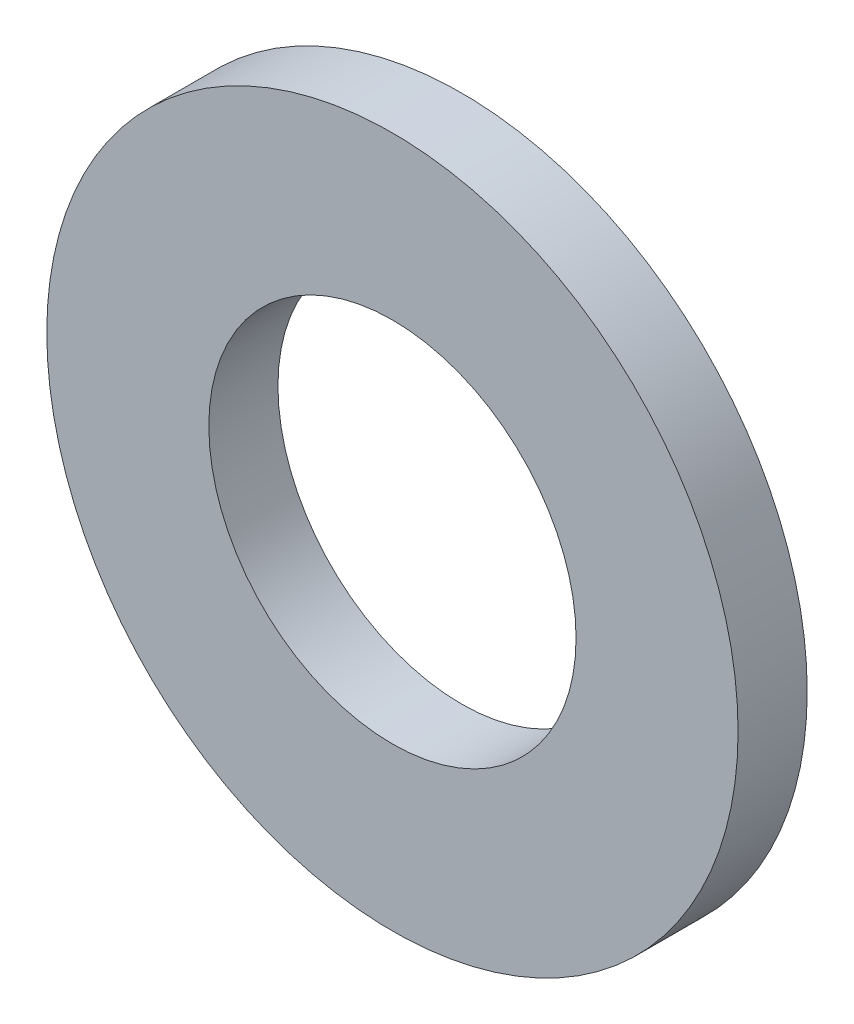
ISO-10303-21;
HEADER;
FILE_DESCRIPTION(('STEP AP214'),'2;1');
FILE_NAME('part.step','',(''),(''),'','','');
FILE_SCHEMA(('AUTOMOTIVE_DESIGN { 1 0 10303 214 1 1 1 1 }'));
ENDSEC;
DATA;
#1=APPLICATION_CONTEXT('core data for automotive mechanical design processes');
#2=APPLICATION_PROTOCOL_DEFINITION('international standard','automotive_design',2000,#1);
#3=PRODUCT_CONTEXT('',#1,'mechanical');
#4=PRODUCT('Part','Part','',(#3));
#5=PRODUCT_RELATED_PRODUCT_CATEGORY('part','',(#4));
#6=PRODUCT_DEFINITION_FORMATION('','',#4);
#7=PRODUCT_DEFINITION_CONTEXT('part definition',#1,'design');
#8=PRODUCT_DEFINITION('design','',#6,#7);
#9=PRODUCT_DEFINITION_SHAPE('','',#8);
#10=(LENGTH_UNIT() NAMED_UNIT(*) SI_UNIT(.MILLI.,.METRE.));
#11=(NAMED_UNIT(*) PLANE_ANGLE_UNIT() SI_UNIT($,.RADIAN.));
#12=(NAMED_UNIT(*) SI_UNIT($,.STERADIAN.) SOLID_ANGLE_UNIT());
#13=UNCERTAINTY_MEASURE_WITH_UNIT(LENGTH_MEASURE(1.E-05),#10,'distance_accuracy_value','');
#14=(GEOMETRIC_REPRESENTATION_CONTEXT(3) GLOBAL_UNCERTAINTY_ASSIGNED_CONTEXT((#13)) GLOBAL_UNIT_ASSIGNED_CONTEXT((#10,
#11,#12)) REPRESENTATION_CONTEXT('',''));
#15=CARTESIAN_POINT('',(0.,0.,0.));
#16=DIRECTION('',(0.,0.,1.));
#17=DIRECTION('',(1.,0.,0.));
#18=AXIS2_PLACEMENT_3D('',#15,#16,#17);
#19=CARTESIAN_POINT('',(4.25,0.,0.));
#20=DIRECTION('',(0.,0.,-1.));
#21=DIRECTION('',(-1.,0.,0.));
#22=AXIS2_PLACEMENT_3D('',#19,#20,#21);
#23=PLANE('',#22);
#24=CARTESIAN_POINT('',(0.,0.,0.));
#25=DIRECTION('',(0.,0.,-1.));
#26=DIRECTION('',(-1.,0.,0.));
#27=AXIS2_PLACEMENT_3D('',#24,#25,#26);
#28=CIRCLE('',#27,8.);
#29=CARTESIAN_POINT('',(-8.,0.,0.));
#30=VERTEX_POINT('',#29);
#31=EDGE_CURVE('E10',#30,#30,#28,.T.);
#32=ORIENTED_EDGE('',*,*,#31,.T.);
#33=EDGE_LOOP('',(#32));
#34=FACE_BOUND('',#33,.T.);
#35=CARTESIAN_POINT('',(0.,0.,0.));
#36=DIRECTION('',(0.,0.,-1.));
#37=DIRECTION('',(-1.,0.,0.));
#38=AXIS2_PLACEMENT_3D('',#35,#36,#37);
#39=CIRCLE('',#38,4.25);
#40=CARTESIAN_POINT('',(-4.25,0.,0.));
#41=VERTEX_POINT('',#40);
#42=EDGE_CURVE('E43',#41,#41,#39,.T.);
#43=ORIENTED_EDGE('',*,*,#42,.F.);
#44=EDGE_LOOP('',(#43));
#45=FACE_BOUND('',#44,.T.);
#46=ADVANCED_FACE('F29',(#34,#45),#23,.T.);
#47=CARTESIAN_POINT('',(0.,0.,1.6));
#48=DIRECTION('',(0.,0.,-1.));
#49=DIRECTION('',(-1.,0.,0.));
#50=AXIS2_PLACEMENT_3D('',#47,#48,#49);
#51=CYLINDRICAL_SURFACE('',#50,8.);
#52=CARTESIAN_POINT('',(0.,0.,1.6));
#53=DIRECTION('',(0.,0.,-1.));
#54=DIRECTION('',(-1.,0.,0.));
#55=AXIS2_PLACEMENT_3D('',#52,#53,#54);
#56=CIRCLE('',#55,8.);
#57=CARTESIAN_POINT('',(-8.,0.,1.6));
#58=VERTEX_POINT('',#57);
#59=EDGE_CURVE('E35',#58,#58,#56,.T.);
#60=ORIENTED_EDGE('',*,*,#59,.T.);
#61=EDGE_LOOP('',(#60));
#62=FACE_BOUND('',#61,.T.);
#63=ORIENTED_EDGE('',*,*,#31,.F.);
#64=EDGE_LOOP('',(#63));
#65=FACE_BOUND('',#64,.T.);
#66=ADVANCED_FACE('F53',(#62,#65),#51,.T.);
#67=CARTESIAN_POINT('',(8.,0.,1.6));
#68=DIRECTION('',(0.,0.,1.));
#69=DIRECTION('',(1.,0.,0.));
#70=AXIS2_PLACEMENT_3D('',#67,#68,#69);
#71=PLANE('',#70);
#72=CARTESIAN_POINT('',(0.,0.,1.6));
#73=DIRECTION('',(0.,0.,-1.));
#74=DIRECTION('',(-1.,0.,0.));
#75=AXIS2_PLACEMENT_3D('',#72,#73,#74);
#76=CIRCLE('',#75,4.25);
#77=CARTESIAN_POINT('',(-4.25,0.,1.6));
#78=VERTEX_POINT('',#77);
#79=EDGE_CURVE('E39',#78,#78,#76,.T.);
#80=ORIENTED_EDGE('',*,*,#79,.T.);
#81=EDGE_LOOP('',(#80));
#82=FACE_BOUND('',#81,.T.);
#83=ORIENTED_EDGE('',*,*,#59,.F.);
#84=EDGE_LOOP('',(#83));
#85=FACE_BOUND('',#84,.T.);
#86=ADVANCED_FACE('F57',(#82,#85),#71,.T.);
#87=CARTESIAN_POINT('',(0.,0.,1.6));
#88=DIRECTION('',(0.,0.,-1.));
#89=DIRECTION('',(-1.,0.,0.));
#90=AXIS2_PLACEMENT_3D('',#87,#88,#89);
#91=CYLINDRICAL_SURFACE('',#90,4.25);
#92=ORIENTED_EDGE('',*,*,#42,.T.);
#93=EDGE_LOOP('',(#92));
#94=FACE_BOUND('',#93,.T.);
#95=ORIENTED_EDGE('',*,*,#79,.F.);
#96=EDGE_LOOP('',(#95));
#97=FACE_BOUND('',#96,.T.);
#98=ADVANCED_FACE('F49',(#94,#97),#91,.F.);
#99=CLOSED_SHELL('',(#46,#66,#86,#98));
#100=MANIFOLD_SOLID_BREP('B2',#99);
#101=ADVANCED_BREP_SHAPE_REPRESENTATION('',(#18,#100),#14);
#102=SHAPE_DEFINITION_REPRESENTATION(#9,#101);
ENDSEC;
END-ISO-10303-21;
